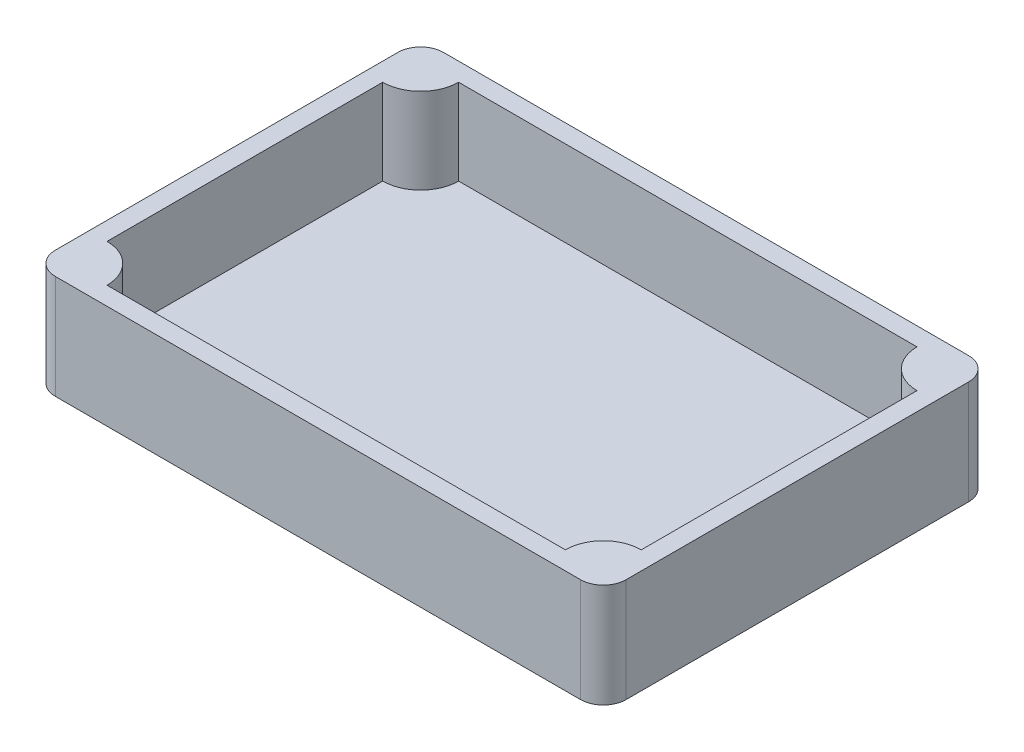
ISO-10303-21;
HEADER;
FILE_DESCRIPTION(('STEP AP214'),'2;1');
FILE_NAME('part.step','',(''),(''),'','','');
FILE_SCHEMA(('AUTOMOTIVE_DESIGN { 1 0 10303 214 1 1 1 1 }'));
ENDSEC;
DATA;
#1=APPLICATION_CONTEXT('core data for automotive mechanical design processes');
#2=APPLICATION_PROTOCOL_DEFINITION('international standard','automotive_design',2000,#1);
#3=PRODUCT_CONTEXT('',#1,'mechanical');
#4=PRODUCT('Part','Part','',(#3));
#5=PRODUCT_RELATED_PRODUCT_CATEGORY('part','',(#4));
#6=PRODUCT_DEFINITION_FORMATION('','',#4);
#7=PRODUCT_DEFINITION_CONTEXT('part definition',#1,'design');
#8=PRODUCT_DEFINITION('design','',#6,#7);
#9=PRODUCT_DEFINITION_SHAPE('','',#8);
#10=(LENGTH_UNIT() NAMED_UNIT(*) SI_UNIT(.MILLI.,.METRE.));
#11=(NAMED_UNIT(*) PLANE_ANGLE_UNIT() SI_UNIT($,.RADIAN.));
#12=(NAMED_UNIT(*) SI_UNIT($,.STERADIAN.) SOLID_ANGLE_UNIT());
#13=UNCERTAINTY_MEASURE_WITH_UNIT(LENGTH_MEASURE(1.E-05),#10,'distance_accuracy_value','');
#14=(GEOMETRIC_REPRESENTATION_CONTEXT(3) GLOBAL_UNCERTAINTY_ASSIGNED_CONTEXT((#13)) GLOBAL_UNIT_ASSIGNED_CONTEXT((#10,
#11,#12)) REPRESENTATION_CONTEXT('',''));
#15=CARTESIAN_POINT('',(0.,0.,0.));
#16=DIRECTION('',(0.,0.,1.));
#17=DIRECTION('',(1.,0.,0.));
#18=AXIS2_PLACEMENT_3D('',#15,#16,#17);
#19=CARTESIAN_POINT('',(-46.,3.2,30.));
#20=DIRECTION('',(0.,-1.,0.));
#21=DIRECTION('',(0.,0.,-1.));
#22=AXIS2_PLACEMENT_3D('',#19,#20,#21);
#23=CYLINDRICAL_SURFACE('',#22,4.);
#24=CARTESIAN_POINT('',(-46.,0.,30.));
#25=DIRECTION('',(0.,1.,0.));
#26=DIRECTION('',(0.,0.,-1.));
#27=AXIS2_PLACEMENT_3D('',#24,#25,#26);
#28=CIRCLE('',#27,4.);
#29=CARTESIAN_POINT('',(-50.,0.,30.));
#30=VERTEX_POINT('',#29);
#31=CARTESIAN_POINT('',(-46.,0.,34.));
#32=VERTEX_POINT('',#31);
#33=EDGE_CURVE('E253',#30,#32,#28,.T.);
#34=ORIENTED_EDGE('',*,*,#33,.T.);
#35=DIRECTION('',(0.,-1.,0.));
#36=VECTOR('',#35,1.);
#37=CARTESIAN_POINT('',(-46.,3.2,34.));
#38=LINE('',#37,#36);
#39=CARTESIAN_POINT('',(-46.,18.2,34.));
#40=VERTEX_POINT('',#39);
#41=EDGE_CURVE('E11',#40,#32,#38,.T.);
#42=ORIENTED_EDGE('',*,*,#41,.F.);
#43=CARTESIAN_POINT('',(-46.,18.2,30.));
#44=DIRECTION('',(0.,1.,0.));
#45=DIRECTION('',(0.,0.,1.));
#46=AXIS2_PLACEMENT_3D('',#43,#44,#45);
#47=CIRCLE('',#46,4.);
#48=CARTESIAN_POINT('',(-50.,18.2,30.));
#49=VERTEX_POINT('',#48);
#50=EDGE_CURVE('E164',#49,#40,#47,.T.);
#51=ORIENTED_EDGE('',*,*,#50,.F.);
#52=DIRECTION('',(0.,-1.,0.));
#53=VECTOR('',#52,1.);
#54=CARTESIAN_POINT('',(-50.,3.2,30.));
#55=LINE('',#54,#53);
#56=EDGE_CURVE('E150',#49,#30,#55,.T.);
#57=ORIENTED_EDGE('',*,*,#56,.T.);
#58=EDGE_LOOP('',(#34,#42,#51,#57));
#59=FACE_BOUND('',#58,.T.);
#60=ADVANCED_FACE('F39',(#59),#23,.T.);
#61=CARTESIAN_POINT('',(-46.,3.2,34.));
#62=DIRECTION('',(0.,0.,-1.));
#63=DIRECTION('',(-1.,0.,0.));
#64=AXIS2_PLACEMENT_3D('',#61,#62,#63);
#65=PLANE('',#64);
#66=DIRECTION('',(1.,0.,0.));
#67=VECTOR('',#66,1.);
#68=CARTESIAN_POINT('',(-46.,0.,34.));
#69=LINE('',#68,#67);
#70=CARTESIAN_POINT('',(46.,0.,34.));
#71=VERTEX_POINT('',#70);
#72=EDGE_CURVE('E255',#32,#71,#69,.T.);
#73=ORIENTED_EDGE('',*,*,#72,.T.);
#74=DIRECTION('',(0.,-1.,0.));
#75=VECTOR('',#74,1.);
#76=CARTESIAN_POINT('',(46.,3.2,34.));
#77=LINE('',#76,#75);
#78=CARTESIAN_POINT('',(46.,18.2,34.));
#79=VERTEX_POINT('',#78);
#80=EDGE_CURVE('E46',#79,#71,#77,.T.);
#81=ORIENTED_EDGE('',*,*,#80,.F.);
#82=DIRECTION('',(1.,0.,0.));
#83=VECTOR('',#82,1.);
#84=CARTESIAN_POINT('',(0.,18.2,34.));
#85=LINE('',#84,#83);
#86=EDGE_CURVE('E168',#40,#79,#85,.T.);
#87=ORIENTED_EDGE('',*,*,#86,.F.);
#88=ORIENTED_EDGE('',*,*,#41,.T.);
#89=EDGE_LOOP('',(#73,#81,#87,#88));
#90=FACE_BOUND('',#89,.T.);
#91=ADVANCED_FACE('F312',(#90),#65,.F.);
#92=CARTESIAN_POINT('',(46.,3.2,30.));
#93=DIRECTION('',(0.,-1.,0.));
#94=DIRECTION('',(0.,0.,-1.));
#95=AXIS2_PLACEMENT_3D('',#92,#93,#94);
#96=CYLINDRICAL_SURFACE('',#95,4.);
#97=CARTESIAN_POINT('',(46.,0.,30.));
#98=DIRECTION('',(0.,1.,0.));
#99=DIRECTION('',(0.,0.,1.));
#100=AXIS2_PLACEMENT_3D('',#97,#98,#99);
#101=CIRCLE('',#100,4.);
#102=CARTESIAN_POINT('',(50.,0.,30.));
#103=VERTEX_POINT('',#102);
#104=EDGE_CURVE('E257',#71,#103,#101,.T.);
#105=ORIENTED_EDGE('',*,*,#104,.T.);
#106=DIRECTION('',(0.,-1.,0.));
#107=VECTOR('',#106,1.);
#108=CARTESIAN_POINT('',(50.,3.2,30.));
#109=LINE('',#108,#107);
#110=CARTESIAN_POINT('',(50.,18.2,30.));
#111=VERTEX_POINT('',#110);
#112=EDGE_CURVE('E278',#111,#103,#109,.T.);
#113=ORIENTED_EDGE('',*,*,#112,.F.);
#114=CARTESIAN_POINT('',(46.,18.2,30.));
#115=DIRECTION('',(0.,1.,0.));
#116=DIRECTION('',(0.,0.,1.));
#117=AXIS2_PLACEMENT_3D('',#114,#115,#116);
#118=CIRCLE('',#117,4.);
#119=EDGE_CURVE('E183',#79,#111,#118,.T.);
#120=ORIENTED_EDGE('',*,*,#119,.F.);
#121=ORIENTED_EDGE('',*,*,#80,.T.);
#122=EDGE_LOOP('',(#105,#113,#120,#121));
#123=FACE_BOUND('',#122,.T.);
#124=ADVANCED_FACE('F284',(#123),#96,.T.);
#125=CARTESIAN_POINT('',(50.,3.2,30.));
#126=DIRECTION('',(-1.,0.,0.));
#127=DIRECTION('',(0.,0.,1.));
#128=AXIS2_PLACEMENT_3D('',#125,#126,#127);
#129=PLANE('',#128);
#130=DIRECTION('',(0.,0.,-1.));
#131=VECTOR('',#130,1.);
#132=CARTESIAN_POINT('',(50.,0.,30.));
#133=LINE('',#132,#131);
#134=CARTESIAN_POINT('',(50.,0.,-30.));
#135=VERTEX_POINT('',#134);
#136=EDGE_CURVE('E259',#103,#135,#133,.T.);
#137=ORIENTED_EDGE('',*,*,#136,.T.);
#138=DIRECTION('',(0.,-1.,0.));
#139=VECTOR('',#138,1.);
#140=CARTESIAN_POINT('',(50.,3.2,-30.));
#141=LINE('',#140,#139);
#142=CARTESIAN_POINT('',(50.,18.2,-30.));
#143=VERTEX_POINT('',#142);
#144=EDGE_CURVE('E275',#143,#135,#141,.T.);
#145=ORIENTED_EDGE('',*,*,#144,.F.);
#146=DIRECTION('',(0.,0.,-1.));
#147=VECTOR('',#146,1.);
#148=CARTESIAN_POINT('',(50.,18.2,0.));
#149=LINE('',#148,#147);
#150=EDGE_CURVE('E186',#111,#143,#149,.T.);
#151=ORIENTED_EDGE('',*,*,#150,.F.);
#152=ORIENTED_EDGE('',*,*,#112,.T.);
#153=EDGE_LOOP('',(#137,#145,#151,#152));
#154=FACE_BOUND('',#153,.T.);
#155=ADVANCED_FACE('F292',(#154),#129,.F.);
#156=CARTESIAN_POINT('',(46.,3.2,-30.));
#157=DIRECTION('',(0.,-1.,0.));
#158=DIRECTION('',(0.,0.,-1.));
#159=AXIS2_PLACEMENT_3D('',#156,#157,#158);
#160=CYLINDRICAL_SURFACE('',#159,4.);
#161=CARTESIAN_POINT('',(46.,0.,-30.));
#162=DIRECTION('',(0.,1.,0.));
#163=DIRECTION('',(0.,0.,-1.));
#164=AXIS2_PLACEMENT_3D('',#161,#162,#163);
#165=CIRCLE('',#164,4.);
#166=CARTESIAN_POINT('',(46.,0.,-34.));
#167=VERTEX_POINT('',#166);
#168=EDGE_CURVE('E261',#135,#167,#165,.T.);
#169=ORIENTED_EDGE('',*,*,#168,.T.);
#170=DIRECTION('',(0.,-1.,0.));
#171=VECTOR('',#170,1.);
#172=CARTESIAN_POINT('',(46.,3.2,-34.));
#173=LINE('',#172,#171);
#174=CARTESIAN_POINT('',(46.,18.2,-34.));
#175=VERTEX_POINT('',#174);
#176=EDGE_CURVE('E272',#175,#167,#173,.T.);
#177=ORIENTED_EDGE('',*,*,#176,.F.);
#178=CARTESIAN_POINT('',(46.,18.2,-30.));
#179=DIRECTION('',(0.,1.,0.));
#180=DIRECTION('',(0.,0.,1.));
#181=AXIS2_PLACEMENT_3D('',#178,#179,#180);
#182=CIRCLE('',#181,4.);
#183=EDGE_CURVE('E189',#143,#175,#182,.T.);
#184=ORIENTED_EDGE('',*,*,#183,.F.);
#185=ORIENTED_EDGE('',*,*,#144,.T.);
#186=EDGE_LOOP('',(#169,#177,#184,#185));
#187=FACE_BOUND('',#186,.T.);
#188=ADVANCED_FACE('F296',(#187),#160,.T.);
#189=CARTESIAN_POINT('',(-46.,3.2,-34.));
#190=DIRECTION('',(0.,0.,1.));
#191=DIRECTION('',(1.,0.,0.));
#192=AXIS2_PLACEMENT_3D('',#189,#190,#191);
#193=PLANE('',#192);
#194=DIRECTION('',(-1.,0.,0.));
#195=VECTOR('',#194,1.);
#196=CARTESIAN_POINT('',(-46.,0.,-34.));
#197=LINE('',#196,#195);
#198=CARTESIAN_POINT('',(-46.,0.,-34.));
#199=VERTEX_POINT('',#198);
#200=EDGE_CURVE('E263',#167,#199,#197,.T.);
#201=ORIENTED_EDGE('',*,*,#200,.T.);
#202=DIRECTION('',(0.,-1.,0.));
#203=VECTOR('',#202,1.);
#204=CARTESIAN_POINT('',(-46.,3.2,-34.));
#205=LINE('',#204,#203);
#206=CARTESIAN_POINT('',(-46.,18.2,-34.));
#207=VERTEX_POINT('',#206);
#208=EDGE_CURVE('E269',#207,#199,#205,.T.);
#209=ORIENTED_EDGE('',*,*,#208,.F.);
#210=DIRECTION('',(-1.,0.,0.));
#211=VECTOR('',#210,1.);
#212=CARTESIAN_POINT('',(0.,18.2,-34.));
#213=LINE('',#212,#211);
#214=EDGE_CURVE('E192',#175,#207,#213,.T.);
#215=ORIENTED_EDGE('',*,*,#214,.F.);
#216=ORIENTED_EDGE('',*,*,#176,.T.);
#217=EDGE_LOOP('',(#201,#209,#215,#216));
#218=FACE_BOUND('',#217,.T.);
#219=ADVANCED_FACE('F299',(#218),#193,.F.);
#220=CARTESIAN_POINT('',(-46.,3.2,-30.));
#221=DIRECTION('',(0.,-1.,0.));
#222=DIRECTION('',(0.,0.,-1.));
#223=AXIS2_PLACEMENT_3D('',#220,#221,#222);
#224=CYLINDRICAL_SURFACE('',#223,4.);
#225=CARTESIAN_POINT('',(-46.,0.,-30.));
#226=DIRECTION('',(0.,1.,0.));
#227=DIRECTION('',(0.,0.,-1.));
#228=AXIS2_PLACEMENT_3D('',#225,#226,#227);
#229=CIRCLE('',#228,4.);
#230=CARTESIAN_POINT('',(-50.,0.,-30.));
#231=VERTEX_POINT('',#230);
#232=EDGE_CURVE('E265',#199,#231,#229,.T.);
#233=ORIENTED_EDGE('',*,*,#232,.T.);
#234=DIRECTION('',(0.,-1.,0.));
#235=VECTOR('',#234,1.);
#236=CARTESIAN_POINT('',(-50.,3.2,-30.));
#237=LINE('',#236,#235);
#238=CARTESIAN_POINT('',(-50.,18.2,-30.));
#239=VERTEX_POINT('',#238);
#240=EDGE_CURVE('E161',#239,#231,#237,.T.);
#241=ORIENTED_EDGE('',*,*,#240,.F.);
#242=CARTESIAN_POINT('',(-46.,18.2,-30.));
#243=DIRECTION('',(0.,1.,0.));
#244=DIRECTION('',(0.,0.,1.));
#245=AXIS2_PLACEMENT_3D('',#242,#243,#244);
#246=CIRCLE('',#245,4.);
#247=EDGE_CURVE('E175',#207,#239,#246,.T.);
#248=ORIENTED_EDGE('',*,*,#247,.F.);
#249=ORIENTED_EDGE('',*,*,#208,.T.);
#250=EDGE_LOOP('',(#233,#241,#248,#249));
#251=FACE_BOUND('',#250,.T.);
#252=ADVANCED_FACE('F302',(#251),#224,.T.);
#253=CARTESIAN_POINT('',(-50.,3.2,30.));
#254=DIRECTION('',(1.,0.,0.));
#255=DIRECTION('',(0.,0.,-1.));
#256=AXIS2_PLACEMENT_3D('',#253,#254,#255);
#257=PLANE('',#256);
#258=DIRECTION('',(0.,0.,1.));
#259=VECTOR('',#258,1.);
#260=CARTESIAN_POINT('',(-50.,0.,30.));
#261=LINE('',#260,#259);
#262=EDGE_CURVE('E157',#231,#30,#261,.T.);
#263=ORIENTED_EDGE('',*,*,#262,.T.);
#264=ORIENTED_EDGE('',*,*,#56,.F.);
#265=DIRECTION('',(0.,0.,1.));
#266=VECTOR('',#265,1.);
#267=CARTESIAN_POINT('',(-50.,18.2,0.));
#268=LINE('',#267,#266);
#269=EDGE_CURVE('E155',#239,#49,#268,.T.);
#270=ORIENTED_EDGE('',*,*,#269,.F.);
#271=ORIENTED_EDGE('',*,*,#240,.T.);
#272=EDGE_LOOP('',(#263,#264,#270,#271));
#273=FACE_BOUND('',#272,.T.);
#274=ADVANCED_FACE('F152',(#273),#257,.F.);
#275=CARTESIAN_POINT('',(-46.,0.,30.));
#276=DIRECTION('',(0.,-1.,0.));
#277=DIRECTION('',(0.,0.,-1.));
#278=AXIS2_PLACEMENT_3D('',#275,#276,#277);
#279=PLANE('',#278);
#280=ORIENTED_EDGE('',*,*,#33,.F.);
#281=ORIENTED_EDGE('',*,*,#262,.F.);
#282=ORIENTED_EDGE('',*,*,#232,.F.);
#283=ORIENTED_EDGE('',*,*,#200,.F.);
#284=ORIENTED_EDGE('',*,*,#168,.F.);
#285=ORIENTED_EDGE('',*,*,#136,.F.);
#286=ORIENTED_EDGE('',*,*,#104,.F.);
#287=ORIENTED_EDGE('',*,*,#72,.F.);
#288=EDGE_LOOP('',(#280,#281,#282,#283,#284,#285,#286,#287));
#289=FACE_BOUND('',#288,.T.);
#290=ADVANCED_FACE('F288',(#289),#279,.T.);
#291=CARTESIAN_POINT('',(0.,18.2,30.8));
#292=DIRECTION('',(0.,0.,-1.));
#293=DIRECTION('',(-1.,0.,0.));
#294=AXIS2_PLACEMENT_3D('',#291,#292,#293);
#295=PLANE('',#294);
#296=DIRECTION('',(1.,0.,0.));
#297=VECTOR('',#296,1.);
#298=CARTESIAN_POINT('',(0.,3.2,30.8));
#299=LINE('',#298,#297);
#300=CARTESIAN_POINT('',(-40.15,3.2,30.8));
#301=VERTEX_POINT('',#300);
#302=CARTESIAN_POINT('',(40.15,3.2,30.8));
#303=VERTEX_POINT('',#302);
#304=EDGE_CURVE('E218',#301,#303,#299,.T.);
#305=ORIENTED_EDGE('',*,*,#304,.F.);
#306=DIRECTION('',(0.,-1.,0.));
#307=VECTOR('',#306,1.);
#308=CARTESIAN_POINT('',(-40.15,18.2,30.8));
#309=LINE('',#308,#307);
#310=CARTESIAN_POINT('',(-40.15,18.2,30.8));
#311=VERTEX_POINT('',#310);
#312=EDGE_CURVE('E251',#311,#301,#309,.T.);
#313=ORIENTED_EDGE('',*,*,#312,.F.);
#314=DIRECTION('',(1.,0.,0.));
#315=VECTOR('',#314,1.);
#316=CARTESIAN_POINT('',(0.,18.2,30.8));
#317=LINE('',#316,#315);
#318=CARTESIAN_POINT('',(40.15,18.2,30.8));
#319=VERTEX_POINT('',#318);
#320=EDGE_CURVE('E195',#311,#319,#317,.T.);
#321=ORIENTED_EDGE('',*,*,#320,.T.);
#322=DIRECTION('',(0.,-1.,0.));
#323=VECTOR('',#322,1.);
#324=CARTESIAN_POINT('',(40.15,18.2,30.8));
#325=LINE('',#324,#323);
#326=EDGE_CURVE('E217',#319,#303,#325,.T.);
#327=ORIENTED_EDGE('',*,*,#326,.T.);
#328=EDGE_LOOP('',(#305,#313,#321,#327));
#329=FACE_BOUND('',#328,.T.);
#330=ADVANCED_FACE('F352',(#329),#295,.T.);
#331=CARTESIAN_POINT('',(-46.8,18.2,30.8));
#332=DIRECTION('',(0.,-1.,0.));
#333=DIRECTION('',(0.,0.,-1.));
#334=AXIS2_PLACEMENT_3D('',#331,#332,#333);
#335=CYLINDRICAL_SURFACE('',#334,6.65);
#336=CARTESIAN_POINT('',(-46.8,3.2,30.8));
#337=DIRECTION('',(0.,1.,0.));
#338=DIRECTION('',(0.,0.,1.));
#339=AXIS2_PLACEMENT_3D('',#336,#337,#338);
#340=CIRCLE('',#339,6.65);
#341=CARTESIAN_POINT('',(-46.8,3.2,24.15));
#342=VERTEX_POINT('',#341);
#343=EDGE_CURVE('E53',#301,#342,#340,.T.);
#344=ORIENTED_EDGE('',*,*,#343,.T.);
#345=DIRECTION('',(0.,-1.,0.));
#346=VECTOR('',#345,1.);
#347=CARTESIAN_POINT('',(-46.8,18.2,24.15));
#348=LINE('',#347,#346);
#349=CARTESIAN_POINT('',(-46.8,18.2,24.15));
#350=VERTEX_POINT('',#349);
#351=EDGE_CURVE('E249',#350,#342,#348,.T.);
#352=ORIENTED_EDGE('',*,*,#351,.F.);
#353=CARTESIAN_POINT('',(-46.8,18.2,30.8));
#354=DIRECTION('',(0.,1.,0.));
#355=DIRECTION('',(0.,0.,1.));
#356=AXIS2_PLACEMENT_3D('',#353,#354,#355);
#357=CIRCLE('',#356,6.65);
#358=EDGE_CURVE('E198',#311,#350,#357,.T.);
#359=ORIENTED_EDGE('',*,*,#358,.F.);
#360=ORIENTED_EDGE('',*,*,#312,.T.);
#361=EDGE_LOOP('',(#344,#352,#359,#360));
#362=FACE_BOUND('',#361,.T.);
#363=ADVANCED_FACE('F356',(#362),#335,.T.);
#364=CARTESIAN_POINT('',(-46.8,18.2,0.));
#365=DIRECTION('',(-1.,0.,0.));
#366=DIRECTION('',(0.,0.,1.));
#367=AXIS2_PLACEMENT_3D('',#364,#365,#366);
#368=PLANE('',#367);
#369=DIRECTION('',(0.,0.,-1.));
#370=VECTOR('',#369,1.);
#371=CARTESIAN_POINT('',(-46.8,3.2,0.));
#372=LINE('',#371,#370);
#373=CARTESIAN_POINT('',(-46.8,3.2,-24.15));
#374=VERTEX_POINT('',#373);
#375=EDGE_CURVE('E58',#342,#374,#372,.T.);
#376=ORIENTED_EDGE('',*,*,#375,.T.);
#377=DIRECTION('',(0.,-1.,0.));
#378=VECTOR('',#377,1.);
#379=CARTESIAN_POINT('',(-46.8,18.2,-24.15));
#380=LINE('',#379,#378);
#381=CARTESIAN_POINT('',(-46.8,18.2,-24.15));
#382=VERTEX_POINT('',#381);
#383=EDGE_CURVE('E246',#382,#374,#380,.T.);
#384=ORIENTED_EDGE('',*,*,#383,.F.);
#385=DIRECTION('',(0.,0.,-1.));
#386=VECTOR('',#385,1.);
#387=CARTESIAN_POINT('',(-46.8,18.2,0.));
#388=LINE('',#387,#386);
#389=EDGE_CURVE('E201',#350,#382,#388,.T.);
#390=ORIENTED_EDGE('',*,*,#389,.F.);
#391=ORIENTED_EDGE('',*,*,#351,.T.);
#392=EDGE_LOOP('',(#376,#384,#390,#391));
#393=FACE_BOUND('',#392,.T.);
#394=ADVANCED_FACE('F367',(#393),#368,.F.);
#395=CARTESIAN_POINT('',(-46.8,18.2,-30.8));
#396=DIRECTION('',(0.,-1.,0.));
#397=DIRECTION('',(0.,0.,-1.));
#398=AXIS2_PLACEMENT_3D('',#395,#396,#397);
#399=CYLINDRICAL_SURFACE('',#398,6.65);
#400=CARTESIAN_POINT('',(-46.8,3.2,-30.8));
#401=DIRECTION('',(0.,1.,0.));
#402=DIRECTION('',(0.,0.,1.));
#403=AXIS2_PLACEMENT_3D('',#400,#401,#402);
#404=CIRCLE('',#403,6.65);
#405=CARTESIAN_POINT('',(-40.15,3.2,-30.8));
#406=VERTEX_POINT('',#405);
#407=EDGE_CURVE('E222',#374,#406,#404,.T.);
#408=ORIENTED_EDGE('',*,*,#407,.T.);
#409=DIRECTION('',(0.,-1.,0.));
#410=VECTOR('',#409,1.);
#411=CARTESIAN_POINT('',(-40.15,18.2,-30.8));
#412=LINE('',#411,#410);
#413=CARTESIAN_POINT('',(-40.15,18.2,-30.8));
#414=VERTEX_POINT('',#413);
#415=EDGE_CURVE('E243',#414,#406,#412,.T.);
#416=ORIENTED_EDGE('',*,*,#415,.F.);
#417=CARTESIAN_POINT('',(-46.8,18.2,-30.8));
#418=DIRECTION('',(0.,1.,0.));
#419=DIRECTION('',(0.,0.,1.));
#420=AXIS2_PLACEMENT_3D('',#417,#418,#419);
#421=CIRCLE('',#420,6.65);
#422=EDGE_CURVE('E204',#382,#414,#421,.T.);
#423=ORIENTED_EDGE('',*,*,#422,.F.);
#424=ORIENTED_EDGE('',*,*,#383,.T.);
#425=EDGE_LOOP('',(#408,#416,#423,#424));
#426=FACE_BOUND('',#425,.T.);
#427=ADVANCED_FACE('F378',(#426),#399,.T.);
#428=CARTESIAN_POINT('',(0.,18.2,-30.8));
#429=DIRECTION('',(0.,0.,-1.));
#430=DIRECTION('',(-1.,0.,0.));
#431=AXIS2_PLACEMENT_3D('',#428,#429,#430);
#432=PLANE('',#431);
#433=DIRECTION('',(1.,0.,0.));
#434=VECTOR('',#433,1.);
#435=CARTESIAN_POINT('',(0.,3.2,-30.8));
#436=LINE('',#435,#434);
#437=CARTESIAN_POINT('',(40.1669280767452,3.2,-30.8));
#438=VERTEX_POINT('',#437);
#439=EDGE_CURVE('E225',#406,#438,#436,.T.);
#440=ORIENTED_EDGE('',*,*,#439,.T.);
#441=DIRECTION('',(0.,-1.,0.));
#442=VECTOR('',#441,1.);
#443=CARTESIAN_POINT('',(40.1669280767452,18.2,-30.8));
#444=LINE('',#443,#442);
#445=CARTESIAN_POINT('',(40.1669280767452,18.2,-30.8));
#446=VERTEX_POINT('',#445);
#447=EDGE_CURVE('E240',#446,#438,#444,.T.);
#448=ORIENTED_EDGE('',*,*,#447,.F.);
#449=DIRECTION('',(1.,0.,0.));
#450=VECTOR('',#449,1.);
#451=CARTESIAN_POINT('',(0.,18.2,-30.8));
#452=LINE('',#451,#450);
#453=EDGE_CURVE('E207',#414,#446,#452,.T.);
#454=ORIENTED_EDGE('',*,*,#453,.F.);
#455=ORIENTED_EDGE('',*,*,#415,.T.);
#456=EDGE_LOOP('',(#440,#448,#454,#455));
#457=FACE_BOUND('',#456,.T.);
#458=ADVANCED_FACE('F389',(#457),#432,.F.);
#459=CARTESIAN_POINT('',(46.8,18.2,-30.8));
#460=DIRECTION('',(0.,-1.,0.));
#461=DIRECTION('',(0.,0.,-1.));
#462=AXIS2_PLACEMENT_3D('',#459,#460,#461);
#463=CYLINDRICAL_SURFACE('',#462,6.63307192325483);
#464=CARTESIAN_POINT('',(46.8,3.2,-30.8));
#465=DIRECTION('',(0.,1.,0.));
#466=DIRECTION('',(0.,0.,1.));
#467=AXIS2_PLACEMENT_3D('',#464,#465,#466);
#468=CIRCLE('',#467,6.63307192325483);
#469=CARTESIAN_POINT('',(46.8,3.2,-24.1669280767452));
#470=VERTEX_POINT('',#469);
#471=EDGE_CURVE('E228',#438,#470,#468,.T.);
#472=ORIENTED_EDGE('',*,*,#471,.T.);
#473=DIRECTION('',(0.,-1.,0.));
#474=VECTOR('',#473,1.);
#475=CARTESIAN_POINT('',(46.8,18.2,-24.1669280767452));
#476=LINE('',#475,#474);
#477=CARTESIAN_POINT('',(46.8,18.2,-24.1669280767452));
#478=VERTEX_POINT('',#477);
#479=EDGE_CURVE('E237',#478,#470,#476,.T.);
#480=ORIENTED_EDGE('',*,*,#479,.F.);
#481=CARTESIAN_POINT('',(46.8,18.2,-30.8));
#482=DIRECTION('',(0.,1.,0.));
#483=DIRECTION('',(0.,0.,1.));
#484=AXIS2_PLACEMENT_3D('',#481,#482,#483);
#485=CIRCLE('',#484,6.63307192325483);
#486=EDGE_CURVE('E210',#446,#478,#485,.T.);
#487=ORIENTED_EDGE('',*,*,#486,.F.);
#488=ORIENTED_EDGE('',*,*,#447,.T.);
#489=EDGE_LOOP('',(#472,#480,#487,#488));
#490=FACE_BOUND('',#489,.T.);
#491=ADVANCED_FACE('F400',(#490),#463,.T.);
#492=CARTESIAN_POINT('',(46.8,18.2,0.));
#493=DIRECTION('',(-1.,0.,0.));
#494=DIRECTION('',(0.,0.,1.));
#495=AXIS2_PLACEMENT_3D('',#492,#493,#494);
#496=PLANE('',#495);
#497=DIRECTION('',(0.,0.,-1.));
#498=VECTOR('',#497,1.);
#499=CARTESIAN_POINT('',(46.8,3.2,0.));
#500=LINE('',#499,#498);
#501=CARTESIAN_POINT('',(46.8,3.2,24.15));
#502=VERTEX_POINT('',#501);
#503=EDGE_CURVE('E179',#502,#470,#500,.T.);
#504=ORIENTED_EDGE('',*,*,#503,.F.);
#505=DIRECTION('',(0.,-1.,0.));
#506=VECTOR('',#505,1.);
#507=CARTESIAN_POINT('',(46.8,18.2,24.15));
#508=LINE('',#507,#506);
#509=CARTESIAN_POINT('',(46.8,18.2,24.15));
#510=VERTEX_POINT('',#509);
#511=EDGE_CURVE('E234',#510,#502,#508,.T.);
#512=ORIENTED_EDGE('',*,*,#511,.F.);
#513=DIRECTION('',(0.,0.,-1.));
#514=VECTOR('',#513,1.);
#515=CARTESIAN_POINT('',(46.8,18.2,0.));
#516=LINE('',#515,#514);
#517=EDGE_CURVE('E212',#510,#478,#516,.T.);
#518=ORIENTED_EDGE('',*,*,#517,.T.);
#519=ORIENTED_EDGE('',*,*,#479,.T.);
#520=EDGE_LOOP('',(#504,#512,#518,#519));
#521=FACE_BOUND('',#520,.T.);
#522=ADVANCED_FACE('F411',(#521),#496,.T.);
#523=CARTESIAN_POINT('',(46.8,18.2,30.8));
#524=DIRECTION('',(0.,-1.,0.));
#525=DIRECTION('',(0.,0.,-1.));
#526=AXIS2_PLACEMENT_3D('',#523,#524,#525);
#527=CYLINDRICAL_SURFACE('',#526,6.65);
#528=CARTESIAN_POINT('',(46.8,3.2,30.8));
#529=DIRECTION('',(0.,1.,0.));
#530=DIRECTION('',(0.,0.,1.));
#531=AXIS2_PLACEMENT_3D('',#528,#529,#530);
#532=CIRCLE('',#531,6.65);
#533=EDGE_CURVE('E176',#502,#303,#532,.T.);
#534=ORIENTED_EDGE('',*,*,#533,.T.);
#535=ORIENTED_EDGE('',*,*,#326,.F.);
#536=CARTESIAN_POINT('',(46.8,18.2,30.8));
#537=DIRECTION('',(0.,1.,0.));
#538=DIRECTION('',(0.,0.,1.));
#539=AXIS2_PLACEMENT_3D('',#536,#537,#538);
#540=CIRCLE('',#539,6.65);
#541=EDGE_CURVE('E215',#510,#319,#540,.T.);
#542=ORIENTED_EDGE('',*,*,#541,.F.);
#543=ORIENTED_EDGE('',*,*,#511,.T.);
#544=EDGE_LOOP('',(#534,#535,#542,#543));
#545=FACE_BOUND('',#544,.T.);
#546=ADVANCED_FACE('F422',(#545),#527,.T.);
#547=CARTESIAN_POINT('',(0.,18.2,0.));
#548=DIRECTION('',(0.,1.,0.));
#549=DIRECTION('',(0.,0.,1.));
#550=AXIS2_PLACEMENT_3D('',#547,#548,#549);
#551=PLANE('',#550);
#552=ORIENTED_EDGE('',*,*,#269,.T.);
#553=ORIENTED_EDGE('',*,*,#50,.T.);
#554=ORIENTED_EDGE('',*,*,#86,.T.);
#555=ORIENTED_EDGE('',*,*,#119,.T.);
#556=ORIENTED_EDGE('',*,*,#150,.T.);
#557=ORIENTED_EDGE('',*,*,#183,.T.);
#558=ORIENTED_EDGE('',*,*,#214,.T.);
#559=ORIENTED_EDGE('',*,*,#247,.T.);
#560=EDGE_LOOP('',(#552,#553,#554,#555,#556,#557,#558,#559));
#561=FACE_BOUND('',#560,.T.);
#562=ORIENTED_EDGE('',*,*,#320,.F.);
#563=ORIENTED_EDGE('',*,*,#358,.T.);
#564=ORIENTED_EDGE('',*,*,#389,.T.);
#565=ORIENTED_EDGE('',*,*,#422,.T.);
#566=ORIENTED_EDGE('',*,*,#453,.T.);
#567=ORIENTED_EDGE('',*,*,#486,.T.);
#568=ORIENTED_EDGE('',*,*,#517,.F.);
#569=ORIENTED_EDGE('',*,*,#541,.T.);
#570=EDGE_LOOP('',(#562,#563,#564,#565,#566,#567,#568,#569));
#571=FACE_BOUND('',#570,.T.);
#572=ADVANCED_FACE('F171',(#561,#571),#551,.T.);
#573=CARTESIAN_POINT('',(-46.,3.2,30.));
#574=DIRECTION('',(0.,-1.,0.));
#575=DIRECTION('',(0.,0.,-1.));
#576=AXIS2_PLACEMENT_3D('',#573,#574,#575);
#577=PLANE('',#576);
#578=ORIENTED_EDGE('',*,*,#343,.F.);
#579=ORIENTED_EDGE('',*,*,#304,.T.);
#580=ORIENTED_EDGE('',*,*,#533,.F.);
#581=ORIENTED_EDGE('',*,*,#503,.T.);
#582=ORIENTED_EDGE('',*,*,#471,.F.);
#583=ORIENTED_EDGE('',*,*,#439,.F.);
#584=ORIENTED_EDGE('',*,*,#407,.F.);
#585=ORIENTED_EDGE('',*,*,#375,.F.);
#586=EDGE_LOOP('',(#578,#579,#580,#581,#582,#583,#584,#585));
#587=FACE_BOUND('',#586,.T.);
#588=ADVANCED_FACE('F443',(#587),#577,.F.);
#589=CLOSED_SHELL('',(#60,#91,#124,#155,#188,#219,#252,#274,#290,#330,#363,#394,#427,#458,#491,
#522,#546,#572,#588));
#590=MANIFOLD_SOLID_BREP('B2',#589);
#591=ADVANCED_BREP_SHAPE_REPRESENTATION('',(#18,#590),#14);
#592=SHAPE_DEFINITION_REPRESENTATION(#9,#591);
ENDSEC;
END-ISO-10303-21;
